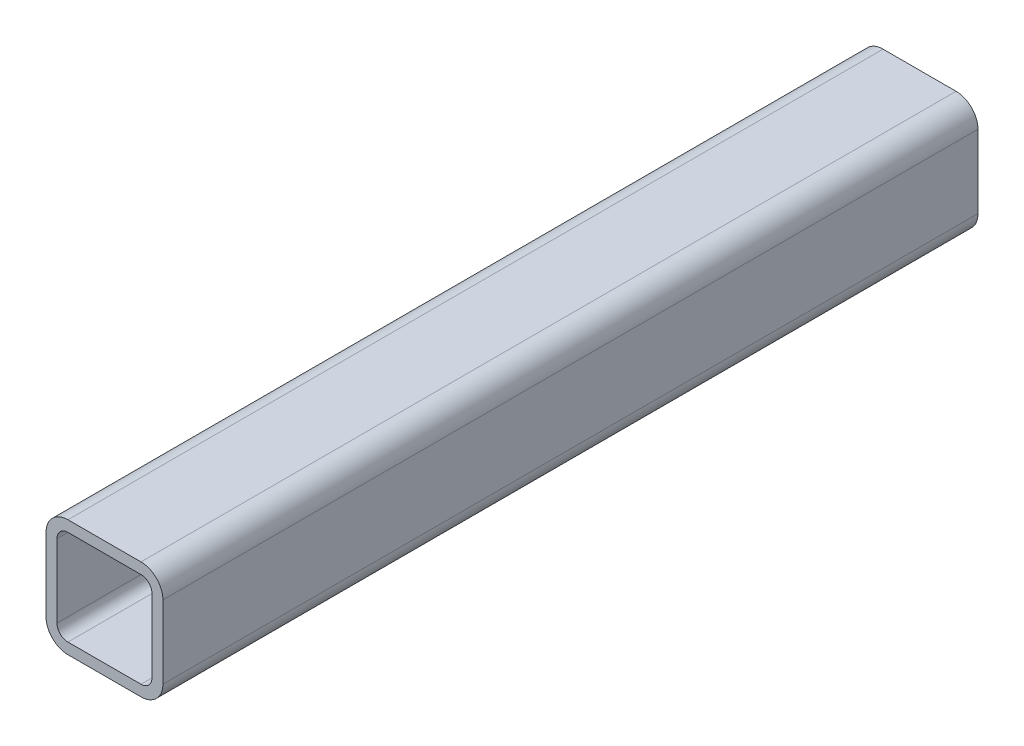
ISO-10303-21;
HEADER;
FILE_DESCRIPTION(('STEP AP214'),'2;1');
FILE_NAME('part.step','',(''),(''),'','','');
FILE_SCHEMA(('AUTOMOTIVE_DESIGN { 1 0 10303 214 1 1 1 1 }'));
ENDSEC;
DATA;
#1=APPLICATION_CONTEXT('core data for automotive mechanical design processes');
#2=APPLICATION_PROTOCOL_DEFINITION('international standard','automotive_design',2000,#1);
#3=PRODUCT_CONTEXT('',#1,'mechanical');
#4=PRODUCT('Part','Part','',(#3));
#5=PRODUCT_RELATED_PRODUCT_CATEGORY('part','',(#4));
#6=PRODUCT_DEFINITION_FORMATION('','',#4);
#7=PRODUCT_DEFINITION_CONTEXT('part definition',#1,'design');
#8=PRODUCT_DEFINITION('design','',#6,#7);
#9=PRODUCT_DEFINITION_SHAPE('','',#8);
#10=(LENGTH_UNIT() NAMED_UNIT(*) SI_UNIT(.MILLI.,.METRE.));
#11=(NAMED_UNIT(*) PLANE_ANGLE_UNIT() SI_UNIT($,.RADIAN.));
#12=(NAMED_UNIT(*) SI_UNIT($,.STERADIAN.) SOLID_ANGLE_UNIT());
#13=UNCERTAINTY_MEASURE_WITH_UNIT(LENGTH_MEASURE(1.E-05),#10,'distance_accuracy_value','');
#14=(GEOMETRIC_REPRESENTATION_CONTEXT(3) GLOBAL_UNCERTAINTY_ASSIGNED_CONTEXT((#13)) GLOBAL_UNIT_ASSIGNED_CONTEXT((#10,
#11,#12)) REPRESENTATION_CONTEXT('',''));
#15=CARTESIAN_POINT('',(0.,0.,0.));
#16=DIRECTION('',(0.,0.,1.));
#17=DIRECTION('',(1.,0.,0.));
#18=AXIS2_PLACEMENT_3D('',#15,#16,#17);
#19=CARTESIAN_POINT('',(41.27,41.27,354.2));
#20=DIRECTION('',(0.,0.,-1.));
#21=DIRECTION('',(-1.,0.,0.));
#22=AXIS2_PLACEMENT_3D('',#19,#20,#21);
#23=PLANE('',#22);
#24=CARTESIAN_POINT('',(41.27,41.27,354.2));
#25=DIRECTION('',(0.,0.,1.));
#26=DIRECTION('',(-1.,0.,0.));
#27=AXIS2_PLACEMENT_3D('',#24,#25,#26);
#28=CIRCLE('',#27,9.53);
#29=CARTESIAN_POINT('',(50.8,41.2699999999999,354.2));
#30=VERTEX_POINT('',#29);
#31=CARTESIAN_POINT('',(41.2699999999999,50.8,354.2));
#32=VERTEX_POINT('',#31);
#33=EDGE_CURVE('E246',#30,#32,#28,.T.);
#34=ORIENTED_EDGE('',*,*,#33,.T.);
#35=DIRECTION('',(-1.,0.,0.));
#36=VECTOR('',#35,1.);
#37=CARTESIAN_POINT('',(9.53000000000007,50.8,354.2));
#38=LINE('',#37,#36);
#39=CARTESIAN_POINT('',(9.53000000000007,50.8,354.2));
#40=VERTEX_POINT('',#39);
#41=EDGE_CURVE('E250',#32,#40,#38,.T.);
#42=ORIENTED_EDGE('',*,*,#41,.T.);
#43=CARTESIAN_POINT('',(9.53,41.27,354.2));
#44=DIRECTION('',(0.,0.,1.));
#45=DIRECTION('',(-1.,0.,0.));
#46=AXIS2_PLACEMENT_3D('',#43,#44,#45);
#47=CIRCLE('',#46,9.53);
#48=CARTESIAN_POINT('',(0.,41.2699999999999,354.2));
#49=VERTEX_POINT('',#48);
#50=EDGE_CURVE('E254',#40,#49,#47,.T.);
#51=ORIENTED_EDGE('',*,*,#50,.T.);
#52=DIRECTION('',(0.,-1.,0.));
#53=VECTOR('',#52,1.);
#54=CARTESIAN_POINT('',(0.,9.53000000000007,354.2));
#55=LINE('',#54,#53);
#56=CARTESIAN_POINT('',(0.,9.53000000000007,354.2));
#57=VERTEX_POINT('',#56);
#58=EDGE_CURVE('E257',#49,#57,#55,.T.);
#59=ORIENTED_EDGE('',*,*,#58,.T.);
#60=CARTESIAN_POINT('',(9.53,9.53,354.2));
#61=DIRECTION('',(0.,0.,1.));
#62=DIRECTION('',(-1.,0.,0.));
#63=AXIS2_PLACEMENT_3D('',#60,#61,#62);
#64=CIRCLE('',#63,9.53);
#65=CARTESIAN_POINT('',(9.53000000000007,0.,354.2));
#66=VERTEX_POINT('',#65);
#67=EDGE_CURVE('E260',#57,#66,#64,.T.);
#68=ORIENTED_EDGE('',*,*,#67,.T.);
#69=DIRECTION('',(1.,0.,0.));
#70=VECTOR('',#69,1.);
#71=CARTESIAN_POINT('',(9.53000000000007,0.,354.2));
#72=LINE('',#71,#70);
#73=CARTESIAN_POINT('',(41.2699999999999,0.,354.2));
#74=VERTEX_POINT('',#73);
#75=EDGE_CURVE('E263',#66,#74,#72,.T.);
#76=ORIENTED_EDGE('',*,*,#75,.T.);
#77=CARTESIAN_POINT('',(41.27,9.53,354.2));
#78=DIRECTION('',(0.,0.,1.));
#79=DIRECTION('',(-1.,0.,0.));
#80=AXIS2_PLACEMENT_3D('',#77,#78,#79);
#81=CIRCLE('',#80,9.53);
#82=CARTESIAN_POINT('',(50.8,9.53000000000007,354.2));
#83=VERTEX_POINT('',#82);
#84=EDGE_CURVE('E266',#74,#83,#81,.T.);
#85=ORIENTED_EDGE('',*,*,#84,.T.);
#86=DIRECTION('',(0.,1.,0.));
#87=VECTOR('',#86,1.);
#88=CARTESIAN_POINT('',(50.8,9.53000000000007,354.2));
#89=LINE('',#88,#87);
#90=EDGE_CURVE('E269',#83,#30,#89,.T.);
#91=ORIENTED_EDGE('',*,*,#90,.T.);
#92=EDGE_LOOP('',(#34,#42,#51,#59,#68,#76,#85,#91));
#93=FACE_BOUND('',#92,.T.);
#94=CARTESIAN_POINT('',(9.52,9.52,354.2));
#95=DIRECTION('',(0.,0.,1.));
#96=DIRECTION('',(1.,0.,0.));
#97=AXIS2_PLACEMENT_3D('',#94,#95,#96);
#98=CIRCLE('',#97,4.76);
#99=CARTESIAN_POINT('',(4.76,9.52000000000003,354.2));
#100=VERTEX_POINT('',#99);
#101=CARTESIAN_POINT('',(9.52000000000004,4.76,354.2));
#102=VERTEX_POINT('',#101);
#103=EDGE_CURVE('E157',#100,#102,#98,.T.);
#104=ORIENTED_EDGE('',*,*,#103,.F.);
#105=DIRECTION('',(0.,-1.,0.));
#106=VECTOR('',#105,1.);
#107=CARTESIAN_POINT('',(4.76,41.28,354.2));
#108=LINE('',#107,#106);
#109=CARTESIAN_POINT('',(4.76,41.28,354.2));
#110=VERTEX_POINT('',#109);
#111=EDGE_CURVE('E198',#110,#100,#108,.T.);
#112=ORIENTED_EDGE('',*,*,#111,.F.);
#113=CARTESIAN_POINT('',(9.52,41.28,354.2));
#114=DIRECTION('',(0.,0.,1.));
#115=DIRECTION('',(-1.,0.,0.));
#116=AXIS2_PLACEMENT_3D('',#113,#114,#115);
#117=CIRCLE('',#116,4.76);
#118=CARTESIAN_POINT('',(9.52000000000003,46.04,354.2));
#119=VERTEX_POINT('',#118);
#120=EDGE_CURVE('E195',#119,#110,#117,.T.);
#121=ORIENTED_EDGE('',*,*,#120,.F.);
#122=DIRECTION('',(-1.,0.,0.));
#123=VECTOR('',#122,1.);
#124=CARTESIAN_POINT('',(9.52000000000003,46.04,354.2));
#125=LINE('',#124,#123);
#126=CARTESIAN_POINT('',(41.28,46.04,354.2));
#127=VERTEX_POINT('',#126);
#128=EDGE_CURVE('E192',#127,#119,#125,.T.);
#129=ORIENTED_EDGE('',*,*,#128,.F.);
#130=CARTESIAN_POINT('',(41.28,41.28,354.2));
#131=DIRECTION('',(0.,0.,1.));
#132=DIRECTION('',(1.,0.,0.));
#133=AXIS2_PLACEMENT_3D('',#130,#131,#132);
#134=CIRCLE('',#133,4.76);
#135=CARTESIAN_POINT('',(46.04,41.28,354.2));
#136=VERTEX_POINT('',#135);
#137=EDGE_CURVE('E189',#136,#127,#134,.T.);
#138=ORIENTED_EDGE('',*,*,#137,.F.);
#139=DIRECTION('',(0.,1.,0.));
#140=VECTOR('',#139,1.);
#141=CARTESIAN_POINT('',(46.04,41.28,354.2));
#142=LINE('',#141,#140);
#143=CARTESIAN_POINT('',(46.04,9.52000000000003,354.2));
#144=VERTEX_POINT('',#143);
#145=EDGE_CURVE('E184',#144,#136,#142,.T.);
#146=ORIENTED_EDGE('',*,*,#145,.F.);
#147=CARTESIAN_POINT('',(41.28,9.52,354.2));
#148=DIRECTION('',(0.,0.,1.));
#149=DIRECTION('',(1.,0.,0.));
#150=AXIS2_PLACEMENT_3D('',#147,#148,#149);
#151=CIRCLE('',#150,4.76);
#152=CARTESIAN_POINT('',(41.28,4.76,354.2));
#153=VERTEX_POINT('',#152);
#154=EDGE_CURVE('E180',#153,#144,#151,.T.);
#155=ORIENTED_EDGE('',*,*,#154,.F.);
#156=DIRECTION('',(1.,0.,0.));
#157=VECTOR('',#156,1.);
#158=CARTESIAN_POINT('',(9.52000000000004,4.76,354.2));
#159=LINE('',#158,#157);
#160=EDGE_CURVE('E166',#102,#153,#159,.T.);
#161=ORIENTED_EDGE('',*,*,#160,.F.);
#162=EDGE_LOOP('',(#104,#112,#121,#129,#138,#146,#155,#161));
#163=FACE_BOUND('',#162,.T.);
#164=ADVANCED_FACE('F43',(#93,#163),#23,.F.);
#165=CARTESIAN_POINT('',(41.27,41.27,0.));
#166=DIRECTION('',(0.,0.,-1.));
#167=DIRECTION('',(-1.,0.,0.));
#168=AXIS2_PLACEMENT_3D('',#165,#166,#167);
#169=PLANE('',#168);
#170=CARTESIAN_POINT('',(41.27,41.27,0.));
#171=DIRECTION('',(0.,0.,1.));
#172=DIRECTION('',(-1.,0.,0.));
#173=AXIS2_PLACEMENT_3D('',#170,#171,#172);
#174=CIRCLE('',#173,9.53);
#175=CARTESIAN_POINT('',(50.8,41.2699999999999,0.));
#176=VERTEX_POINT('',#175);
#177=CARTESIAN_POINT('',(41.2699999999999,50.8,0.));
#178=VERTEX_POINT('',#177);
#179=EDGE_CURVE('E175',#176,#178,#174,.T.);
#180=ORIENTED_EDGE('',*,*,#179,.F.);
#181=DIRECTION('',(0.,1.,0.));
#182=VECTOR('',#181,1.);
#183=CARTESIAN_POINT('',(50.8,9.53000000000007,0.));
#184=LINE('',#183,#182);
#185=CARTESIAN_POINT('',(50.8,9.53000000000007,0.));
#186=VERTEX_POINT('',#185);
#187=EDGE_CURVE('E251',#186,#176,#184,.T.);
#188=ORIENTED_EDGE('',*,*,#187,.F.);
#189=CARTESIAN_POINT('',(41.27,9.53,0.));
#190=DIRECTION('',(0.,0.,1.));
#191=DIRECTION('',(-1.,0.,0.));
#192=AXIS2_PLACEMENT_3D('',#189,#190,#191);
#193=CIRCLE('',#192,9.53);
#194=CARTESIAN_POINT('',(41.2699999999999,0.,0.));
#195=VERTEX_POINT('',#194);
#196=EDGE_CURVE('E291',#195,#186,#193,.T.);
#197=ORIENTED_EDGE('',*,*,#196,.F.);
#198=DIRECTION('',(1.,0.,0.));
#199=VECTOR('',#198,1.);
#200=CARTESIAN_POINT('',(9.53000000000007,0.,0.));
#201=LINE('',#200,#199);
#202=CARTESIAN_POINT('',(9.53000000000007,0.,0.));
#203=VERTEX_POINT('',#202);
#204=EDGE_CURVE('E288',#203,#195,#201,.T.);
#205=ORIENTED_EDGE('',*,*,#204,.F.);
#206=CARTESIAN_POINT('',(9.53,9.53,0.));
#207=DIRECTION('',(0.,0.,1.));
#208=DIRECTION('',(-1.,0.,0.));
#209=AXIS2_PLACEMENT_3D('',#206,#207,#208);
#210=CIRCLE('',#209,9.53);
#211=CARTESIAN_POINT('',(0.,9.53000000000007,0.));
#212=VERTEX_POINT('',#211);
#213=EDGE_CURVE('E285',#212,#203,#210,.T.);
#214=ORIENTED_EDGE('',*,*,#213,.F.);
#215=DIRECTION('',(0.,-1.,0.));
#216=VECTOR('',#215,1.);
#217=CARTESIAN_POINT('',(0.,9.53000000000007,0.));
#218=LINE('',#217,#216);
#219=CARTESIAN_POINT('',(0.,41.2699999999999,0.));
#220=VERTEX_POINT('',#219);
#221=EDGE_CURVE('E282',#220,#212,#218,.T.);
#222=ORIENTED_EDGE('',*,*,#221,.F.);
#223=CARTESIAN_POINT('',(9.53,41.27,0.));
#224=DIRECTION('',(0.,0.,1.));
#225=DIRECTION('',(-1.,0.,0.));
#226=AXIS2_PLACEMENT_3D('',#223,#224,#225);
#227=CIRCLE('',#226,9.53);
#228=CARTESIAN_POINT('',(9.53000000000007,50.8,0.));
#229=VERTEX_POINT('',#228);
#230=EDGE_CURVE('E279',#229,#220,#227,.T.);
#231=ORIENTED_EDGE('',*,*,#230,.F.);
#232=DIRECTION('',(-1.,0.,0.));
#233=VECTOR('',#232,1.);
#234=CARTESIAN_POINT('',(9.53000000000007,50.8,0.));
#235=LINE('',#234,#233);
#236=EDGE_CURVE('E276',#178,#229,#235,.T.);
#237=ORIENTED_EDGE('',*,*,#236,.F.);
#238=EDGE_LOOP('',(#180,#188,#197,#205,#214,#222,#231,#237));
#239=FACE_BOUND('',#238,.T.);
#240=DIRECTION('',(0.,-1.,0.));
#241=VECTOR('',#240,1.);
#242=CARTESIAN_POINT('',(4.76,41.28,0.));
#243=LINE('',#242,#241);
#244=CARTESIAN_POINT('',(4.76,41.28,0.));
#245=VERTEX_POINT('',#244);
#246=CARTESIAN_POINT('',(4.76,9.52000000000004,0.));
#247=VERTEX_POINT('',#246);
#248=EDGE_CURVE('E167',#245,#247,#243,.T.);
#249=ORIENTED_EDGE('',*,*,#248,.T.);
#250=CARTESIAN_POINT('',(9.52,9.52,0.));
#251=DIRECTION('',(0.,0.,1.));
#252=DIRECTION('',(1.,0.,0.));
#253=AXIS2_PLACEMENT_3D('',#250,#251,#252);
#254=CIRCLE('',#253,4.76);
#255=CARTESIAN_POINT('',(9.52000000000004,4.76,0.));
#256=VERTEX_POINT('',#255);
#257=EDGE_CURVE('E67',#247,#256,#254,.T.);
#258=ORIENTED_EDGE('',*,*,#257,.T.);
#259=DIRECTION('',(1.,0.,0.));
#260=VECTOR('',#259,1.);
#261=CARTESIAN_POINT('',(9.52000000000004,4.76,0.));
#262=LINE('',#261,#260);
#263=CARTESIAN_POINT('',(41.28,4.76,0.));
#264=VERTEX_POINT('',#263);
#265=EDGE_CURVE('E173',#256,#264,#262,.T.);
#266=ORIENTED_EDGE('',*,*,#265,.T.);
#267=CARTESIAN_POINT('',(41.28,9.52,0.));
#268=DIRECTION('',(0.,0.,1.));
#269=DIRECTION('',(1.,0.,0.));
#270=AXIS2_PLACEMENT_3D('',#267,#268,#269);
#271=CIRCLE('',#270,4.76);
#272=CARTESIAN_POINT('',(46.04,9.52000000000003,0.));
#273=VERTEX_POINT('',#272);
#274=EDGE_CURVE('E205',#264,#273,#271,.T.);
#275=ORIENTED_EDGE('',*,*,#274,.T.);
#276=DIRECTION('',(0.,1.,0.));
#277=VECTOR('',#276,1.);
#278=CARTESIAN_POINT('',(46.04,41.28,0.));
#279=LINE('',#278,#277);
#280=CARTESIAN_POINT('',(46.04,41.28,0.));
#281=VERTEX_POINT('',#280);
#282=EDGE_CURVE('E209',#273,#281,#279,.T.);
#283=ORIENTED_EDGE('',*,*,#282,.T.);
#284=CARTESIAN_POINT('',(41.28,41.28,0.));
#285=DIRECTION('',(0.,0.,1.));
#286=DIRECTION('',(1.,0.,0.));
#287=AXIS2_PLACEMENT_3D('',#284,#285,#286);
#288=CIRCLE('',#287,4.76);
#289=CARTESIAN_POINT('',(41.28,46.04,0.));
#290=VERTEX_POINT('',#289);
#291=EDGE_CURVE('E213',#281,#290,#288,.T.);
#292=ORIENTED_EDGE('',*,*,#291,.T.);
#293=DIRECTION('',(-1.,0.,0.));
#294=VECTOR('',#293,1.);
#295=CARTESIAN_POINT('',(9.52000000000003,46.04,0.));
#296=LINE('',#295,#294);
#297=CARTESIAN_POINT('',(9.52000000000003,46.04,0.));
#298=VERTEX_POINT('',#297);
#299=EDGE_CURVE('E217',#290,#298,#296,.T.);
#300=ORIENTED_EDGE('',*,*,#299,.T.);
#301=CARTESIAN_POINT('',(9.52,41.28,0.));
#302=DIRECTION('',(0.,0.,1.));
#303=DIRECTION('',(-1.,0.,0.));
#304=AXIS2_PLACEMENT_3D('',#301,#302,#303);
#305=CIRCLE('',#304,4.76);
#306=EDGE_CURVE('E221',#298,#245,#305,.T.);
#307=ORIENTED_EDGE('',*,*,#306,.T.);
#308=EDGE_LOOP('',(#249,#258,#266,#275,#283,#292,#300,#307));
#309=FACE_BOUND('',#308,.T.);
#310=ADVANCED_FACE('F330',(#239,#309),#169,.T.);
#311=CARTESIAN_POINT('',(41.27,41.27,354.2));
#312=DIRECTION('',(0.,0.,-1.));
#313=DIRECTION('',(-1.,0.,0.));
#314=AXIS2_PLACEMENT_3D('',#311,#312,#313);
#315=CYLINDRICAL_SURFACE('',#314,9.53);
#316=ORIENTED_EDGE('',*,*,#179,.T.);
#317=DIRECTION('',(0.,0.,-1.));
#318=VECTOR('',#317,1.);
#319=CARTESIAN_POINT('',(41.2699999999999,50.8,354.2));
#320=LINE('',#319,#318);
#321=EDGE_CURVE('E11',#32,#178,#320,.T.);
#322=ORIENTED_EDGE('',*,*,#321,.F.);
#323=ORIENTED_EDGE('',*,*,#33,.F.);
#324=DIRECTION('',(0.,0.,-1.));
#325=VECTOR('',#324,1.);
#326=CARTESIAN_POINT('',(50.8,41.2699999999999,354.2));
#327=LINE('',#326,#325);
#328=EDGE_CURVE('E272',#30,#176,#327,.T.);
#329=ORIENTED_EDGE('',*,*,#328,.T.);
#330=EDGE_LOOP('',(#316,#322,#323,#329));
#331=FACE_BOUND('',#330,.T.);
#332=ADVANCED_FACE('F45',(#331),#315,.T.);
#333=CARTESIAN_POINT('',(9.53000000000007,50.8,354.2));
#334=DIRECTION('',(0.,-1.,0.));
#335=DIRECTION('',(0.,0.,-1.));
#336=AXIS2_PLACEMENT_3D('',#333,#334,#335);
#337=PLANE('',#336);
#338=ORIENTED_EDGE('',*,*,#236,.T.);
#339=DIRECTION('',(0.,0.,-1.));
#340=VECTOR('',#339,1.);
#341=CARTESIAN_POINT('',(9.53000000000007,50.8,354.2));
#342=LINE('',#341,#340);
#343=EDGE_CURVE('E52',#40,#229,#342,.T.);
#344=ORIENTED_EDGE('',*,*,#343,.F.);
#345=ORIENTED_EDGE('',*,*,#41,.F.);
#346=ORIENTED_EDGE('',*,*,#321,.T.);
#347=EDGE_LOOP('',(#338,#344,#345,#346));
#348=FACE_BOUND('',#347,.T.);
#349=ADVANCED_FACE('F347',(#348),#337,.F.);
#350=CARTESIAN_POINT('',(9.53,41.27,354.2));
#351=DIRECTION('',(0.,0.,-1.));
#352=DIRECTION('',(-1.,0.,0.));
#353=AXIS2_PLACEMENT_3D('',#350,#351,#352);
#354=CYLINDRICAL_SURFACE('',#353,9.53);
#355=ORIENTED_EDGE('',*,*,#230,.T.);
#356=DIRECTION('',(0.,0.,-1.));
#357=VECTOR('',#356,1.);
#358=CARTESIAN_POINT('',(0.,41.2699999999999,354.2));
#359=LINE('',#358,#357);
#360=EDGE_CURVE('E315',#49,#220,#359,.T.);
#361=ORIENTED_EDGE('',*,*,#360,.F.);
#362=ORIENTED_EDGE('',*,*,#50,.F.);
#363=ORIENTED_EDGE('',*,*,#343,.T.);
#364=EDGE_LOOP('',(#355,#361,#362,#363));
#365=FACE_BOUND('',#364,.T.);
#366=ADVANCED_FACE('F324',(#365),#354,.T.);
#367=CARTESIAN_POINT('',(0.,9.53000000000007,354.2));
#368=DIRECTION('',(1.,0.,0.));
#369=DIRECTION('',(0.,0.,-1.));
#370=AXIS2_PLACEMENT_3D('',#367,#368,#369);
#371=PLANE('',#370);
#372=ORIENTED_EDGE('',*,*,#221,.T.);
#373=DIRECTION('',(0.,0.,-1.));
#374=VECTOR('',#373,1.);
#375=CARTESIAN_POINT('',(0.,9.53000000000007,354.2));
#376=LINE('',#375,#374);
#377=EDGE_CURVE('E311',#57,#212,#376,.T.);
#378=ORIENTED_EDGE('',*,*,#377,.F.);
#379=ORIENTED_EDGE('',*,*,#58,.F.);
#380=ORIENTED_EDGE('',*,*,#360,.T.);
#381=EDGE_LOOP('',(#372,#378,#379,#380));
#382=FACE_BOUND('',#381,.T.);
#383=ADVANCED_FACE('F336',(#382),#371,.F.);
#384=CARTESIAN_POINT('',(9.53,9.53,354.2));
#385=DIRECTION('',(0.,0.,-1.));
#386=DIRECTION('',(-1.,0.,0.));
#387=AXIS2_PLACEMENT_3D('',#384,#385,#386);
#388=CYLINDRICAL_SURFACE('',#387,9.53);
#389=ORIENTED_EDGE('',*,*,#213,.T.);
#390=DIRECTION('',(0.,0.,-1.));
#391=VECTOR('',#390,1.);
#392=CARTESIAN_POINT('',(9.53000000000007,0.,354.2));
#393=LINE('',#392,#391);
#394=EDGE_CURVE('E307',#66,#203,#393,.T.);
#395=ORIENTED_EDGE('',*,*,#394,.F.);
#396=ORIENTED_EDGE('',*,*,#67,.F.);
#397=ORIENTED_EDGE('',*,*,#377,.T.);
#398=EDGE_LOOP('',(#389,#395,#396,#397));
#399=FACE_BOUND('',#398,.T.);
#400=ADVANCED_FACE('F340',(#399),#388,.T.);
#401=CARTESIAN_POINT('',(9.53000000000007,0.,354.2));
#402=DIRECTION('',(0.,1.,0.));
#403=DIRECTION('',(0.,0.,1.));
#404=AXIS2_PLACEMENT_3D('',#401,#402,#403);
#405=PLANE('',#404);
#406=ORIENTED_EDGE('',*,*,#204,.T.);
#407=DIRECTION('',(0.,0.,-1.));
#408=VECTOR('',#407,1.);
#409=CARTESIAN_POINT('',(41.2699999999999,0.,354.2));
#410=LINE('',#409,#408);
#411=EDGE_CURVE('E303',#74,#195,#410,.T.);
#412=ORIENTED_EDGE('',*,*,#411,.F.);
#413=ORIENTED_EDGE('',*,*,#75,.F.);
#414=ORIENTED_EDGE('',*,*,#394,.T.);
#415=EDGE_LOOP('',(#406,#412,#413,#414));
#416=FACE_BOUND('',#415,.T.);
#417=ADVANCED_FACE('F360',(#416),#405,.F.);
#418=CARTESIAN_POINT('',(41.27,9.53,354.2));
#419=DIRECTION('',(0.,0.,-1.));
#420=DIRECTION('',(-1.,0.,0.));
#421=AXIS2_PLACEMENT_3D('',#418,#419,#420);
#422=CYLINDRICAL_SURFACE('',#421,9.53);
#423=ORIENTED_EDGE('',*,*,#196,.T.);
#424=DIRECTION('',(0.,0.,-1.));
#425=VECTOR('',#424,1.);
#426=CARTESIAN_POINT('',(50.8,9.53000000000007,354.2));
#427=LINE('',#426,#425);
#428=EDGE_CURVE('E299',#83,#186,#427,.T.);
#429=ORIENTED_EDGE('',*,*,#428,.F.);
#430=ORIENTED_EDGE('',*,*,#84,.F.);
#431=ORIENTED_EDGE('',*,*,#411,.T.);
#432=EDGE_LOOP('',(#423,#429,#430,#431));
#433=FACE_BOUND('',#432,.T.);
#434=ADVANCED_FACE('F358',(#433),#422,.T.);
#435=CARTESIAN_POINT('',(50.8,9.53000000000007,354.2));
#436=DIRECTION('',(-1.,0.,0.));
#437=DIRECTION('',(0.,0.,1.));
#438=AXIS2_PLACEMENT_3D('',#435,#436,#437);
#439=PLANE('',#438);
#440=ORIENTED_EDGE('',*,*,#187,.T.);
#441=ORIENTED_EDGE('',*,*,#328,.F.);
#442=ORIENTED_EDGE('',*,*,#90,.F.);
#443=ORIENTED_EDGE('',*,*,#428,.T.);
#444=EDGE_LOOP('',(#440,#441,#442,#443));
#445=FACE_BOUND('',#444,.T.);
#446=ADVANCED_FACE('F353',(#445),#439,.F.);
#447=CARTESIAN_POINT('',(9.52,9.52,354.2));
#448=DIRECTION('',(0.,0.,-1.));
#449=DIRECTION('',(-1.,0.,0.));
#450=AXIS2_PLACEMENT_3D('',#447,#448,#449);
#451=CYLINDRICAL_SURFACE('',#450,4.76);
#452=ORIENTED_EDGE('',*,*,#257,.F.);
#453=DIRECTION('',(0.,0.,-1.));
#454=VECTOR('',#453,1.);
#455=CARTESIAN_POINT('',(4.76,9.52000000000003,354.2));
#456=LINE('',#455,#454);
#457=EDGE_CURVE('E161',#100,#247,#456,.T.);
#458=ORIENTED_EDGE('',*,*,#457,.F.);
#459=ORIENTED_EDGE('',*,*,#103,.T.);
#460=DIRECTION('',(0.,0.,-1.));
#461=VECTOR('',#460,1.);
#462=CARTESIAN_POINT('',(9.52000000000004,4.76,354.2));
#463=LINE('',#462,#461);
#464=EDGE_CURVE('E160',#102,#256,#463,.T.);
#465=ORIENTED_EDGE('',*,*,#464,.T.);
#466=EDGE_LOOP('',(#452,#458,#459,#465));
#467=FACE_BOUND('',#466,.T.);
#468=ADVANCED_FACE('F159',(#467),#451,.F.);
#469=CARTESIAN_POINT('',(9.52000000000004,4.76,354.2));
#470=DIRECTION('',(0.,1.,0.));
#471=DIRECTION('',(-1.,0.,0.));
#472=AXIS2_PLACEMENT_3D('',#469,#470,#471);
#473=PLANE('',#472);
#474=ORIENTED_EDGE('',*,*,#265,.F.);
#475=ORIENTED_EDGE('',*,*,#464,.F.);
#476=ORIENTED_EDGE('',*,*,#160,.T.);
#477=DIRECTION('',(0.,0.,-1.));
#478=VECTOR('',#477,1.);
#479=CARTESIAN_POINT('',(41.28,4.76,354.2));
#480=LINE('',#479,#478);
#481=EDGE_CURVE('E176',#153,#264,#480,.T.);
#482=ORIENTED_EDGE('',*,*,#481,.T.);
#483=EDGE_LOOP('',(#474,#475,#476,#482));
#484=FACE_BOUND('',#483,.T.);
#485=ADVANCED_FACE('F170',(#484),#473,.T.);
#486=CARTESIAN_POINT('',(41.28,9.52,354.2));
#487=DIRECTION('',(0.,0.,-1.));
#488=DIRECTION('',(-1.,0.,0.));
#489=AXIS2_PLACEMENT_3D('',#486,#487,#488);
#490=CYLINDRICAL_SURFACE('',#489,4.76);
#491=ORIENTED_EDGE('',*,*,#274,.F.);
#492=ORIENTED_EDGE('',*,*,#481,.F.);
#493=ORIENTED_EDGE('',*,*,#154,.T.);
#494=DIRECTION('',(0.,0.,-1.));
#495=VECTOR('',#494,1.);
#496=CARTESIAN_POINT('',(46.04,9.52000000000003,354.2));
#497=LINE('',#496,#495);
#498=EDGE_CURVE('E241',#144,#273,#497,.T.);
#499=ORIENTED_EDGE('',*,*,#498,.T.);
#500=EDGE_LOOP('',(#491,#492,#493,#499));
#501=FACE_BOUND('',#500,.T.);
#502=ADVANCED_FACE('F385',(#501),#490,.F.);
#503=CARTESIAN_POINT('',(46.04,41.28,354.2));
#504=DIRECTION('',(-1.,0.,0.));
#505=DIRECTION('',(0.,-1.,0.));
#506=AXIS2_PLACEMENT_3D('',#503,#504,#505);
#507=PLANE('',#506);
#508=ORIENTED_EDGE('',*,*,#282,.F.);
#509=ORIENTED_EDGE('',*,*,#498,.F.);
#510=ORIENTED_EDGE('',*,*,#145,.T.);
#511=DIRECTION('',(0.,0.,-1.));
#512=VECTOR('',#511,1.);
#513=CARTESIAN_POINT('',(46.04,41.28,354.2));
#514=LINE('',#513,#512);
#515=EDGE_CURVE('E238',#136,#281,#514,.T.);
#516=ORIENTED_EDGE('',*,*,#515,.T.);
#517=EDGE_LOOP('',(#508,#509,#510,#516));
#518=FACE_BOUND('',#517,.T.);
#519=ADVANCED_FACE('F389',(#518),#507,.T.);
#520=CARTESIAN_POINT('',(41.28,41.28,354.2));
#521=DIRECTION('',(0.,0.,-1.));
#522=DIRECTION('',(-1.,0.,0.));
#523=AXIS2_PLACEMENT_3D('',#520,#521,#522);
#524=CYLINDRICAL_SURFACE('',#523,4.76);
#525=ORIENTED_EDGE('',*,*,#291,.F.);
#526=ORIENTED_EDGE('',*,*,#515,.F.);
#527=ORIENTED_EDGE('',*,*,#137,.T.);
#528=DIRECTION('',(0.,0.,-1.));
#529=VECTOR('',#528,1.);
#530=CARTESIAN_POINT('',(41.28,46.04,354.2));
#531=LINE('',#530,#529);
#532=EDGE_CURVE('E235',#127,#290,#531,.T.);
#533=ORIENTED_EDGE('',*,*,#532,.T.);
#534=EDGE_LOOP('',(#525,#526,#527,#533));
#535=FACE_BOUND('',#534,.T.);
#536=ADVANCED_FACE('F395',(#535),#524,.F.);
#537=CARTESIAN_POINT('',(9.52000000000003,46.04,354.2));
#538=DIRECTION('',(0.,-1.,0.));
#539=DIRECTION('',(0.,0.,-1.));
#540=AXIS2_PLACEMENT_3D('',#537,#538,#539);
#541=PLANE('',#540);
#542=ORIENTED_EDGE('',*,*,#299,.F.);
#543=ORIENTED_EDGE('',*,*,#532,.F.);
#544=ORIENTED_EDGE('',*,*,#128,.T.);
#545=DIRECTION('',(0.,0.,-1.));
#546=VECTOR('',#545,1.);
#547=CARTESIAN_POINT('',(9.52000000000003,46.04,354.2));
#548=LINE('',#547,#546);
#549=EDGE_CURVE('E232',#119,#298,#548,.T.);
#550=ORIENTED_EDGE('',*,*,#549,.T.);
#551=EDGE_LOOP('',(#542,#543,#544,#550));
#552=FACE_BOUND('',#551,.T.);
#553=ADVANCED_FACE('F399',(#552),#541,.T.);
#554=CARTESIAN_POINT('',(9.52,41.28,354.2));
#555=DIRECTION('',(0.,0.,-1.));
#556=DIRECTION('',(-1.,0.,0.));
#557=AXIS2_PLACEMENT_3D('',#554,#555,#556);
#558=CYLINDRICAL_SURFACE('',#557,4.76);
#559=ORIENTED_EDGE('',*,*,#306,.F.);
#560=ORIENTED_EDGE('',*,*,#549,.F.);
#561=ORIENTED_EDGE('',*,*,#120,.T.);
#562=DIRECTION('',(0.,0.,-1.));
#563=VECTOR('',#562,1.);
#564=CARTESIAN_POINT('',(4.76,41.28,354.2));
#565=LINE('',#564,#563);
#566=EDGE_CURVE('E59',#110,#245,#565,.T.);
#567=ORIENTED_EDGE('',*,*,#566,.T.);
#568=EDGE_LOOP('',(#559,#560,#561,#567));
#569=FACE_BOUND('',#568,.T.);
#570=ADVANCED_FACE('F403',(#569),#558,.F.);
#571=CARTESIAN_POINT('',(4.76,41.28,354.2));
#572=DIRECTION('',(1.,0.,0.));
#573=DIRECTION('',(0.,1.,0.));
#574=AXIS2_PLACEMENT_3D('',#571,#572,#573);
#575=PLANE('',#574);
#576=ORIENTED_EDGE('',*,*,#248,.F.);
#577=ORIENTED_EDGE('',*,*,#566,.F.);
#578=ORIENTED_EDGE('',*,*,#111,.T.);
#579=ORIENTED_EDGE('',*,*,#457,.T.);
#580=EDGE_LOOP('',(#576,#577,#578,#579));
#581=FACE_BOUND('',#580,.T.);
#582=ADVANCED_FACE('F407',(#581),#575,.T.);
#583=CLOSED_SHELL('',(#164,#310,#332,#349,#366,#383,#400,#417,#434,#446,#468,#485,#502,#519,
#536,#553,#570,#582));
#584=MANIFOLD_SOLID_BREP('B2',#583);
#585=ADVANCED_BREP_SHAPE_REPRESENTATION('',(#18,#584),#14);
#586=SHAPE_DEFINITION_REPRESENTATION(#9,#585);
ENDSEC;
END-ISO-10303-21;
